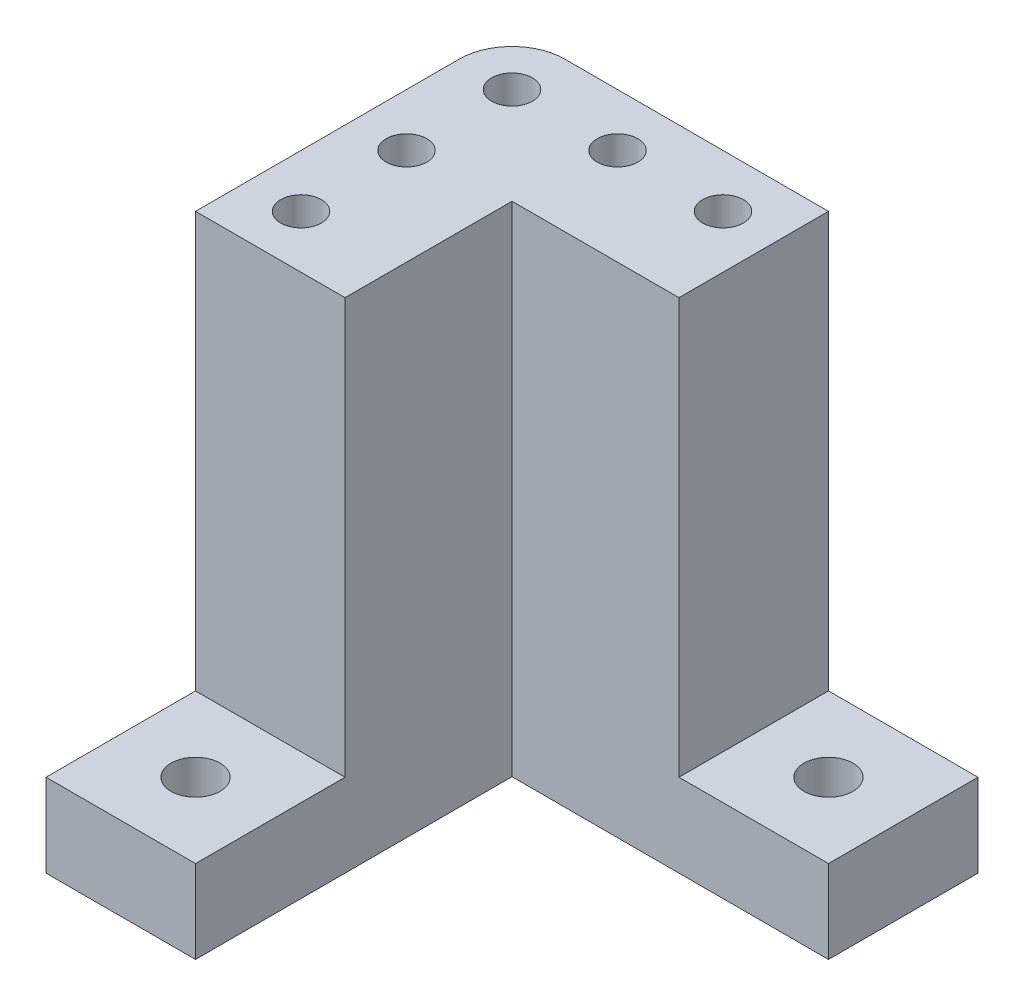
ISO-10303-21;
HEADER;
FILE_DESCRIPTION(('STEP AP214'),'2;1');
FILE_NAME('part.step','',(''),(''),'','','');
FILE_SCHEMA(('AUTOMOTIVE_DESIGN { 1 0 10303 214 1 1 1 1 }'));
ENDSEC;
DATA;
#1=APPLICATION_CONTEXT('core data for automotive mechanical design processes');
#2=APPLICATION_PROTOCOL_DEFINITION('international standard','automotive_design',2000,#1);
#3=PRODUCT_CONTEXT('',#1,'mechanical');
#4=PRODUCT('Part','Part','',(#3));
#5=PRODUCT_RELATED_PRODUCT_CATEGORY('part','',(#4));
#6=PRODUCT_DEFINITION_FORMATION('','',#4);
#7=PRODUCT_DEFINITION_CONTEXT('part definition',#1,'design');
#8=PRODUCT_DEFINITION('design','',#6,#7);
#9=PRODUCT_DEFINITION_SHAPE('','',#8);
#10=(LENGTH_UNIT() NAMED_UNIT(*) SI_UNIT(.MILLI.,.METRE.));
#11=(NAMED_UNIT(*) PLANE_ANGLE_UNIT() SI_UNIT($,.RADIAN.));
#12=(NAMED_UNIT(*) SI_UNIT($,.STERADIAN.) SOLID_ANGLE_UNIT());
#13=UNCERTAINTY_MEASURE_WITH_UNIT(LENGTH_MEASURE(1.E-05),#10,'distance_accuracy_value','');
#14=(GEOMETRIC_REPRESENTATION_CONTEXT(3) GLOBAL_UNCERTAINTY_ASSIGNED_CONTEXT((#13)) GLOBAL_UNIT_ASSIGNED_CONTEXT((#10,
#11,#12)) REPRESENTATION_CONTEXT('',''));
#15=CARTESIAN_POINT('',(0.,0.,0.));
#16=DIRECTION('',(0.,0.,1.));
#17=DIRECTION('',(1.,0.,0.));
#18=AXIS2_PLACEMENT_3D('',#15,#16,#17);
#19=CARTESIAN_POINT('',(0.,60.,0.));
#20=DIRECTION('',(0.,1.,0.));
#21=DIRECTION('',(0.,0.,1.));
#22=AXIS2_PLACEMENT_3D('',#19,#20,#21);
#23=PLANE('',#22);
#24=CARTESIAN_POINT('',(6.35000000000002,60.,6.35000000000001));
#25=DIRECTION('',(0.,1.,0.));
#26=DIRECTION('',(0.,0.,1.));
#27=AXIS2_PLACEMENT_3D('',#24,#25,#26);
#28=CIRCLE('',#27,2.45);
#29=CARTESIAN_POINT('',(6.35000000000002,60.,8.80000000000001));
#30=VERTEX_POINT('',#29);
#31=EDGE_CURVE('E191',#30,#30,#28,.T.);
#32=ORIENTED_EDGE('',*,*,#31,.F.);
#33=EDGE_LOOP('',(#32));
#34=FACE_BOUND('',#33,.T.);
#35=CARTESIAN_POINT('',(6.35000000000002,60.,19.05));
#36=DIRECTION('',(0.,1.,0.));
#37=DIRECTION('',(0.,0.,1.));
#38=AXIS2_PLACEMENT_3D('',#35,#36,#37);
#39=CIRCLE('',#38,2.45);
#40=CARTESIAN_POINT('',(6.35000000000002,60.,21.5));
#41=VERTEX_POINT('',#40);
#42=EDGE_CURVE('E188',#41,#41,#39,.T.);
#43=ORIENTED_EDGE('',*,*,#42,.F.);
#44=EDGE_LOOP('',(#43));
#45=FACE_BOUND('',#44,.T.);
#46=CARTESIAN_POINT('',(6.35000000000002,60.,31.75));
#47=DIRECTION('',(0.,1.,0.));
#48=DIRECTION('',(0.,0.,1.));
#49=AXIS2_PLACEMENT_3D('',#46,#47,#48);
#50=CIRCLE('',#49,2.45);
#51=CARTESIAN_POINT('',(6.35000000000002,60.,34.2));
#52=VERTEX_POINT('',#51);
#53=EDGE_CURVE('E195',#52,#52,#50,.T.);
#54=ORIENTED_EDGE('',*,*,#53,.F.);
#55=EDGE_LOOP('',(#54));
#56=FACE_BOUND('',#55,.T.);
#57=CARTESIAN_POINT('',(19.05,60.,6.35000000000001));
#58=DIRECTION('',(0.,1.,0.));
#59=DIRECTION('',(0.,0.,1.));
#60=AXIS2_PLACEMENT_3D('',#57,#58,#59);
#61=CIRCLE('',#60,2.45);
#62=CARTESIAN_POINT('',(19.05,60.,8.80000000000001));
#63=VERTEX_POINT('',#62);
#64=EDGE_CURVE('E201',#63,#63,#61,.T.);
#65=ORIENTED_EDGE('',*,*,#64,.F.);
#66=EDGE_LOOP('',(#65));
#67=FACE_BOUND('',#66,.T.);
#68=CARTESIAN_POINT('',(31.75,60.,6.35000000000001));
#69=DIRECTION('',(0.,1.,0.));
#70=DIRECTION('',(0.,0.,1.));
#71=AXIS2_PLACEMENT_3D('',#68,#69,#70);
#72=CIRCLE('',#71,2.45);
#73=CARTESIAN_POINT('',(31.75,60.,8.80000000000001));
#74=VERTEX_POINT('',#73);
#75=EDGE_CURVE('E207',#74,#74,#72,.T.);
#76=ORIENTED_EDGE('',*,*,#75,.F.);
#77=EDGE_LOOP('',(#76));
#78=FACE_BOUND('',#77,.T.);
#79=CARTESIAN_POINT('',(6.35000000000002,60.,6.35000000000002));
#80=DIRECTION('',(0.,-1.,0.));
#81=DIRECTION('',(0.,0.,1.));
#82=AXIS2_PLACEMENT_3D('',#79,#80,#81);
#83=CIRCLE('',#82,6.35000000000002);
#84=CARTESIAN_POINT('',(0.,60.,6.35000000000001));
#85=VERTEX_POINT('',#84);
#86=CARTESIAN_POINT('',(6.35000000000002,60.,0.));
#87=VERTEX_POINT('',#86);
#88=EDGE_CURVE('E151',#85,#87,#83,.T.);
#89=ORIENTED_EDGE('',*,*,#88,.F.);
#90=DIRECTION('',(0.,0.,1.));
#91=VECTOR('',#90,1.);
#92=CARTESIAN_POINT('',(0.,60.,0.));
#93=LINE('',#92,#91);
#94=CARTESIAN_POINT('',(0.,60.,38.1));
#95=VERTEX_POINT('',#94);
#96=EDGE_CURVE('E218',#85,#95,#93,.T.);
#97=ORIENTED_EDGE('',*,*,#96,.T.);
#98=DIRECTION('',(1.,0.,0.));
#99=VECTOR('',#98,1.);
#100=CARTESIAN_POINT('',(0.,60.,38.1));
#101=LINE('',#100,#99);
#102=CARTESIAN_POINT('',(18.,60.,38.1));
#103=VERTEX_POINT('',#102);
#104=EDGE_CURVE('E220',#95,#103,#101,.T.);
#105=ORIENTED_EDGE('',*,*,#104,.T.);
#106=DIRECTION('',(0.,0.,-1.));
#107=VECTOR('',#106,1.);
#108=CARTESIAN_POINT('',(18.,60.,38.1));
#109=LINE('',#108,#107);
#110=CARTESIAN_POINT('',(18.,60.,18.));
#111=VERTEX_POINT('',#110);
#112=EDGE_CURVE('E223',#103,#111,#109,.T.);
#113=ORIENTED_EDGE('',*,*,#112,.T.);
#114=DIRECTION('',(1.,0.,0.));
#115=VECTOR('',#114,1.);
#116=CARTESIAN_POINT('',(18.,60.,18.));
#117=LINE('',#116,#115);
#118=CARTESIAN_POINT('',(38.1,60.,18.));
#119=VERTEX_POINT('',#118);
#120=EDGE_CURVE('E225',#111,#119,#117,.T.);
#121=ORIENTED_EDGE('',*,*,#120,.T.);
#122=DIRECTION('',(0.,0.,-1.));
#123=VECTOR('',#122,1.);
#124=CARTESIAN_POINT('',(38.1,60.,18.));
#125=LINE('',#124,#123);
#126=CARTESIAN_POINT('',(38.1,60.,0.));
#127=VERTEX_POINT('',#126);
#128=EDGE_CURVE('E227',#119,#127,#125,.T.);
#129=ORIENTED_EDGE('',*,*,#128,.T.);
#130=DIRECTION('',(-1.,0.,0.));
#131=VECTOR('',#130,1.);
#132=CARTESIAN_POINT('',(0.,60.,0.));
#133=LINE('',#132,#131);
#134=EDGE_CURVE('E229',#127,#87,#133,.T.);
#135=ORIENTED_EDGE('',*,*,#134,.T.);
#136=EDGE_LOOP('',(#89,#97,#105,#113,#121,#129,#135));
#137=FACE_BOUND('',#136,.T.);
#138=ADVANCED_FACE('F39',(#34,#45,#56,#67,#78,#137),#23,.T.);
#139=CARTESIAN_POINT('',(0.,0.,0.));
#140=DIRECTION('',(0.,1.,0.));
#141=DIRECTION('',(0.,0.,1.));
#142=AXIS2_PLACEMENT_3D('',#139,#140,#141);
#143=PLANE('',#142);
#144=CARTESIAN_POINT('',(31.75,0.,6.35000000000001));
#145=DIRECTION('',(0.,1.,0.));
#146=DIRECTION('',(0.,0.,1.));
#147=AXIS2_PLACEMENT_3D('',#144,#145,#146);
#148=CIRCLE('',#147,2.45);
#149=CARTESIAN_POINT('',(31.75,0.,8.80000000000001));
#150=VERTEX_POINT('',#149);
#151=EDGE_CURVE('E185',#150,#150,#148,.T.);
#152=ORIENTED_EDGE('',*,*,#151,.T.);
#153=EDGE_LOOP('',(#152));
#154=FACE_BOUND('',#153,.T.);
#155=CARTESIAN_POINT('',(19.05,0.,6.35000000000001));
#156=DIRECTION('',(0.,1.,0.));
#157=DIRECTION('',(0.,0.,1.));
#158=AXIS2_PLACEMENT_3D('',#155,#156,#157);
#159=CIRCLE('',#158,2.45);
#160=CARTESIAN_POINT('',(19.05,0.,8.80000000000001));
#161=VERTEX_POINT('',#160);
#162=EDGE_CURVE('E204',#161,#161,#159,.T.);
#163=ORIENTED_EDGE('',*,*,#162,.T.);
#164=EDGE_LOOP('',(#163));
#165=FACE_BOUND('',#164,.T.);
#166=CARTESIAN_POINT('',(6.35000000000002,0.,31.75));
#167=DIRECTION('',(0.,1.,0.));
#168=DIRECTION('',(0.,0.,1.));
#169=AXIS2_PLACEMENT_3D('',#166,#167,#168);
#170=CIRCLE('',#169,2.45);
#171=CARTESIAN_POINT('',(6.35000000000002,0.,34.2));
#172=VERTEX_POINT('',#171);
#173=EDGE_CURVE('E198',#172,#172,#170,.T.);
#174=ORIENTED_EDGE('',*,*,#173,.T.);
#175=EDGE_LOOP('',(#174));
#176=FACE_BOUND('',#175,.T.);
#177=CARTESIAN_POINT('',(6.35000000000002,0.,19.05));
#178=DIRECTION('',(0.,1.,0.));
#179=DIRECTION('',(0.,0.,1.));
#180=AXIS2_PLACEMENT_3D('',#177,#178,#179);
#181=CIRCLE('',#180,2.45);
#182=CARTESIAN_POINT('',(6.35000000000002,0.,21.5));
#183=VERTEX_POINT('',#182);
#184=EDGE_CURVE('E192',#183,#183,#181,.T.);
#185=ORIENTED_EDGE('',*,*,#184,.T.);
#186=EDGE_LOOP('',(#185));
#187=FACE_BOUND('',#186,.T.);
#188=CARTESIAN_POINT('',(6.35000000000002,0.,6.35000000000001));
#189=DIRECTION('',(0.,1.,0.));
#190=DIRECTION('',(0.,0.,1.));
#191=AXIS2_PLACEMENT_3D('',#188,#189,#190);
#192=CIRCLE('',#191,2.45);
#193=CARTESIAN_POINT('',(6.35000000000002,0.,8.80000000000001));
#194=VERTEX_POINT('',#193);
#195=EDGE_CURVE('E212',#194,#194,#192,.T.);
#196=ORIENTED_EDGE('',*,*,#195,.T.);
#197=EDGE_LOOP('',(#196));
#198=FACE_BOUND('',#197,.T.);
#199=DIRECTION('',(0.,0.,1.));
#200=VECTOR('',#199,1.);
#201=CARTESIAN_POINT('',(0.,0.,0.));
#202=LINE('',#201,#200);
#203=CARTESIAN_POINT('',(0.,0.,6.35000000000001));
#204=VERTEX_POINT('',#203);
#205=CARTESIAN_POINT('',(0.,0.,56.1));
#206=VERTEX_POINT('',#205);
#207=EDGE_CURVE('E215',#204,#206,#202,.T.);
#208=ORIENTED_EDGE('',*,*,#207,.F.);
#209=CARTESIAN_POINT('',(6.35000000000002,0.,6.35000000000002));
#210=DIRECTION('',(0.,-1.,0.));
#211=DIRECTION('',(0.,0.,1.));
#212=AXIS2_PLACEMENT_3D('',#209,#210,#211);
#213=CIRCLE('',#212,6.35000000000002);
#214=CARTESIAN_POINT('',(6.35000000000002,0.,0.));
#215=VERTEX_POINT('',#214);
#216=EDGE_CURVE('E178',#204,#215,#213,.T.);
#217=ORIENTED_EDGE('',*,*,#216,.T.);
#218=DIRECTION('',(-1.,0.,0.));
#219=VECTOR('',#218,1.);
#220=CARTESIAN_POINT('',(0.,0.,0.));
#221=LINE('',#220,#219);
#222=CARTESIAN_POINT('',(56.1,0.,0.));
#223=VERTEX_POINT('',#222);
#224=EDGE_CURVE('E221',#223,#215,#221,.T.);
#225=ORIENTED_EDGE('',*,*,#224,.F.);
#226=DIRECTION('',(0.,0.,1.));
#227=VECTOR('',#226,1.);
#228=CARTESIAN_POINT('',(56.1,0.,0.));
#229=LINE('',#228,#227);
#230=CARTESIAN_POINT('',(56.1,0.,18.));
#231=VERTEX_POINT('',#230);
#232=EDGE_CURVE('E160',#223,#231,#229,.T.);
#233=ORIENTED_EDGE('',*,*,#232,.T.);
#234=DIRECTION('',(1.,0.,0.));
#235=VECTOR('',#234,1.);
#236=CARTESIAN_POINT('',(18.,0.,18.));
#237=LINE('',#236,#235);
#238=CARTESIAN_POINT('',(18.,0.,18.));
#239=VERTEX_POINT('',#238);
#240=EDGE_CURVE('E236',#239,#231,#237,.T.);
#241=ORIENTED_EDGE('',*,*,#240,.F.);
#242=DIRECTION('',(0.,0.,-1.));
#243=VECTOR('',#242,1.);
#244=CARTESIAN_POINT('',(18.,0.,38.1));
#245=LINE('',#244,#243);
#246=CARTESIAN_POINT('',(18.,0.,56.1));
#247=VERTEX_POINT('',#246);
#248=EDGE_CURVE('E234',#247,#239,#245,.T.);
#249=ORIENTED_EDGE('',*,*,#248,.F.);
#250=DIRECTION('',(-1.,0.,0.));
#251=VECTOR('',#250,1.);
#252=CARTESIAN_POINT('',(18.,0.,56.1));
#253=LINE('',#252,#251);
#254=EDGE_CURVE('E131',#247,#206,#253,.T.);
#255=ORIENTED_EDGE('',*,*,#254,.T.);
#256=EDGE_LOOP('',(#208,#217,#225,#233,#241,#249,#255));
#257=FACE_BOUND('',#256,.T.);
#258=CARTESIAN_POINT('',(47.1,0.,9.));
#259=DIRECTION('',(0.,-1.,0.));
#260=DIRECTION('',(0.,0.,-1.));
#261=AXIS2_PLACEMENT_3D('',#258,#259,#260);
#262=CIRCLE('',#261,2.95);
#263=CARTESIAN_POINT('',(47.1,0.,6.04999999999999));
#264=VERTEX_POINT('',#263);
#265=EDGE_CURVE('E172',#264,#264,#262,.T.);
#266=ORIENTED_EDGE('',*,*,#265,.F.);
#267=EDGE_LOOP('',(#266));
#268=FACE_BOUND('',#267,.T.);
#269=CARTESIAN_POINT('',(9.,0.,47.1));
#270=DIRECTION('',(0.,-1.,0.));
#271=DIRECTION('',(0.,0.,-1.));
#272=AXIS2_PLACEMENT_3D('',#269,#270,#271);
#273=CIRCLE('',#272,2.95);
#274=CARTESIAN_POINT('',(9.,0.,44.15));
#275=VERTEX_POINT('',#274);
#276=EDGE_CURVE('E175',#275,#275,#273,.T.);
#277=ORIENTED_EDGE('',*,*,#276,.F.);
#278=EDGE_LOOP('',(#277));
#279=FACE_BOUND('',#278,.T.);
#280=ADVANCED_FACE('F255',(#154,#165,#176,#187,#198,#257,#268,#279),#143,.F.);
#281=CARTESIAN_POINT('',(0.,60.,0.));
#282=DIRECTION('',(1.,0.,0.));
#283=DIRECTION('',(0.,0.,-1.));
#284=AXIS2_PLACEMENT_3D('',#281,#282,#283);
#285=PLANE('',#284);
#286=ORIENTED_EDGE('',*,*,#96,.F.);
#287=DIRECTION('',(0.,1.,0.));
#288=VECTOR('',#287,1.);
#289=CARTESIAN_POINT('',(0.,0.,6.35000000000001));
#290=LINE('',#289,#288);
#291=EDGE_CURVE('E183',#204,#85,#290,.T.);
#292=ORIENTED_EDGE('',*,*,#291,.F.);
#293=ORIENTED_EDGE('',*,*,#207,.T.);
#294=DIRECTION('',(0.,-1.,0.));
#295=VECTOR('',#294,1.);
#296=CARTESIAN_POINT('',(0.,10.,56.1));
#297=LINE('',#296,#295);
#298=CARTESIAN_POINT('',(0.,10.,56.1));
#299=VERTEX_POINT('',#298);
#300=EDGE_CURVE('E133',#299,#206,#297,.T.);
#301=ORIENTED_EDGE('',*,*,#300,.F.);
#302=DIRECTION('',(0.,0.,-1.));
#303=VECTOR('',#302,1.);
#304=CARTESIAN_POINT('',(0.,10.,38.1));
#305=LINE('',#304,#303);
#306=CARTESIAN_POINT('',(0.,10.,38.1));
#307=VERTEX_POINT('',#306);
#308=EDGE_CURVE('E134',#299,#307,#305,.T.);
#309=ORIENTED_EDGE('',*,*,#308,.T.);
#310=DIRECTION('',(0.,-1.,0.));
#311=VECTOR('',#310,1.);
#312=CARTESIAN_POINT('',(0.,60.,38.1));
#313=LINE('',#312,#311);
#314=EDGE_CURVE('E11',#95,#307,#313,.T.);
#315=ORIENTED_EDGE('',*,*,#314,.F.);
#316=EDGE_LOOP('',(#286,#292,#293,#301,#309,#315));
#317=FACE_BOUND('',#316,.T.);
#318=ADVANCED_FACE('F41',(#317),#285,.F.);
#319=CARTESIAN_POINT('',(0.,60.,38.1));
#320=DIRECTION('',(0.,0.,-1.));
#321=DIRECTION('',(-1.,0.,0.));
#322=AXIS2_PLACEMENT_3D('',#319,#320,#321);
#323=PLANE('',#322);
#324=ORIENTED_EDGE('',*,*,#314,.T.);
#325=DIRECTION('',(1.,0.,0.));
#326=VECTOR('',#325,1.);
#327=CARTESIAN_POINT('',(0.,10.,38.1));
#328=LINE('',#327,#326);
#329=CARTESIAN_POINT('',(18.,10.,38.1));
#330=VERTEX_POINT('',#329);
#331=EDGE_CURVE('E143',#307,#330,#328,.T.);
#332=ORIENTED_EDGE('',*,*,#331,.T.);
#333=DIRECTION('',(0.,-1.,0.));
#334=VECTOR('',#333,1.);
#335=CARTESIAN_POINT('',(18.,60.,38.1));
#336=LINE('',#335,#334);
#337=EDGE_CURVE('E47',#103,#330,#336,.T.);
#338=ORIENTED_EDGE('',*,*,#337,.F.);
#339=ORIENTED_EDGE('',*,*,#104,.F.);
#340=EDGE_LOOP('',(#324,#332,#338,#339));
#341=FACE_BOUND('',#340,.T.);
#342=ADVANCED_FACE('F275',(#341),#323,.F.);
#343=CARTESIAN_POINT('',(18.,60.,38.1));
#344=DIRECTION('',(-1.,0.,0.));
#345=DIRECTION('',(0.,0.,1.));
#346=AXIS2_PLACEMENT_3D('',#343,#344,#345);
#347=PLANE('',#346);
#348=ORIENTED_EDGE('',*,*,#248,.T.);
#349=DIRECTION('',(0.,-1.,0.));
#350=VECTOR('',#349,1.);
#351=CARTESIAN_POINT('',(18.,60.,18.));
#352=LINE('',#351,#350);
#353=EDGE_CURVE('E245',#111,#239,#352,.T.);
#354=ORIENTED_EDGE('',*,*,#353,.F.);
#355=ORIENTED_EDGE('',*,*,#112,.F.);
#356=ORIENTED_EDGE('',*,*,#337,.T.);
#357=DIRECTION('',(0.,0.,1.));
#358=VECTOR('',#357,1.);
#359=CARTESIAN_POINT('',(18.,10.,38.1));
#360=LINE('',#359,#358);
#361=CARTESIAN_POINT('',(18.,10.,56.1));
#362=VERTEX_POINT('',#361);
#363=EDGE_CURVE('E54',#330,#362,#360,.T.);
#364=ORIENTED_EDGE('',*,*,#363,.T.);
#365=DIRECTION('',(0.,-1.,0.));
#366=VECTOR('',#365,1.);
#367=CARTESIAN_POINT('',(18.,10.,56.1));
#368=LINE('',#367,#366);
#369=EDGE_CURVE('E125',#362,#247,#368,.T.);
#370=ORIENTED_EDGE('',*,*,#369,.T.);
#371=EDGE_LOOP('',(#348,#354,#355,#356,#364,#370));
#372=FACE_BOUND('',#371,.T.);
#373=ADVANCED_FACE('F140',(#372),#347,.F.);
#374=CARTESIAN_POINT('',(18.,60.,18.));
#375=DIRECTION('',(0.,0.,-1.));
#376=DIRECTION('',(-1.,0.,0.));
#377=AXIS2_PLACEMENT_3D('',#374,#375,#376);
#378=PLANE('',#377);
#379=ORIENTED_EDGE('',*,*,#240,.T.);
#380=DIRECTION('',(0.,-1.,0.));
#381=VECTOR('',#380,1.);
#382=CARTESIAN_POINT('',(56.1,10.,18.));
#383=LINE('',#382,#381);
#384=CARTESIAN_POINT('',(56.1,10.,18.));
#385=VERTEX_POINT('',#384);
#386=EDGE_CURVE('E157',#385,#231,#383,.T.);
#387=ORIENTED_EDGE('',*,*,#386,.F.);
#388=DIRECTION('',(-1.,0.,0.));
#389=VECTOR('',#388,1.);
#390=CARTESIAN_POINT('',(56.1,10.,18.));
#391=LINE('',#390,#389);
#392=CARTESIAN_POINT('',(38.1,10.,18.));
#393=VERTEX_POINT('',#392);
#394=EDGE_CURVE('E164',#385,#393,#391,.T.);
#395=ORIENTED_EDGE('',*,*,#394,.T.);
#396=DIRECTION('',(0.,-1.,0.));
#397=VECTOR('',#396,1.);
#398=CARTESIAN_POINT('',(38.1,60.,18.));
#399=LINE('',#398,#397);
#400=EDGE_CURVE('E242',#119,#393,#399,.T.);
#401=ORIENTED_EDGE('',*,*,#400,.F.);
#402=ORIENTED_EDGE('',*,*,#120,.F.);
#403=ORIENTED_EDGE('',*,*,#353,.T.);
#404=EDGE_LOOP('',(#379,#387,#395,#401,#402,#403));
#405=FACE_BOUND('',#404,.T.);
#406=ADVANCED_FACE('F251',(#405),#378,.F.);
#407=CARTESIAN_POINT('',(38.1,60.,18.));
#408=DIRECTION('',(-1.,0.,0.));
#409=DIRECTION('',(0.,0.,1.));
#410=AXIS2_PLACEMENT_3D('',#407,#408,#409);
#411=PLANE('',#410);
#412=ORIENTED_EDGE('',*,*,#400,.T.);
#413=DIRECTION('',(0.,0.,-1.));
#414=VECTOR('',#413,1.);
#415=CARTESIAN_POINT('',(38.1,10.,18.));
#416=LINE('',#415,#414);
#417=CARTESIAN_POINT('',(38.1,10.,0.));
#418=VERTEX_POINT('',#417);
#419=EDGE_CURVE('E168',#393,#418,#416,.T.);
#420=ORIENTED_EDGE('',*,*,#419,.T.);
#421=DIRECTION('',(0.,-1.,0.));
#422=VECTOR('',#421,1.);
#423=CARTESIAN_POINT('',(38.1,60.,0.));
#424=LINE('',#423,#422);
#425=EDGE_CURVE('E232',#127,#418,#424,.T.);
#426=ORIENTED_EDGE('',*,*,#425,.F.);
#427=ORIENTED_EDGE('',*,*,#128,.F.);
#428=EDGE_LOOP('',(#412,#420,#426,#427));
#429=FACE_BOUND('',#428,.T.);
#430=ADVANCED_FACE('F264',(#429),#411,.F.);
#431=CARTESIAN_POINT('',(0.,60.,0.));
#432=DIRECTION('',(0.,0.,1.));
#433=DIRECTION('',(1.,0.,0.));
#434=AXIS2_PLACEMENT_3D('',#431,#432,#433);
#435=PLANE('',#434);
#436=ORIENTED_EDGE('',*,*,#224,.T.);
#437=DIRECTION('',(0.,1.,0.));
#438=VECTOR('',#437,1.);
#439=CARTESIAN_POINT('',(6.35000000000002,0.,0.));
#440=LINE('',#439,#438);
#441=EDGE_CURVE('E181',#215,#87,#440,.T.);
#442=ORIENTED_EDGE('',*,*,#441,.T.);
#443=ORIENTED_EDGE('',*,*,#134,.F.);
#444=ORIENTED_EDGE('',*,*,#425,.T.);
#445=DIRECTION('',(1.,0.,0.));
#446=VECTOR('',#445,1.);
#447=CARTESIAN_POINT('',(38.1,10.,0.));
#448=LINE('',#447,#446);
#449=CARTESIAN_POINT('',(56.1,10.,0.));
#450=VERTEX_POINT('',#449);
#451=EDGE_CURVE('E62',#418,#450,#448,.T.);
#452=ORIENTED_EDGE('',*,*,#451,.T.);
#453=DIRECTION('',(0.,-1.,0.));
#454=VECTOR('',#453,1.);
#455=CARTESIAN_POINT('',(56.1,10.,0.));
#456=LINE('',#455,#454);
#457=EDGE_CURVE('E153',#450,#223,#456,.T.);
#458=ORIENTED_EDGE('',*,*,#457,.T.);
#459=EDGE_LOOP('',(#436,#442,#443,#444,#452,#458));
#460=FACE_BOUND('',#459,.T.);
#461=ADVANCED_FACE('F268',(#460),#435,.F.);
#462=CARTESIAN_POINT('',(6.35000000000002,0.,6.35000000000001));
#463=DIRECTION('',(0.,1.,0.));
#464=DIRECTION('',(0.,0.,1.));
#465=AXIS2_PLACEMENT_3D('',#462,#463,#464);
#466=CYLINDRICAL_SURFACE('',#465,2.45);
#467=ORIENTED_EDGE('',*,*,#195,.F.);
#468=EDGE_LOOP('',(#467));
#469=FACE_BOUND('',#468,.T.);
#470=ORIENTED_EDGE('',*,*,#31,.T.);
#471=EDGE_LOOP('',(#470));
#472=FACE_BOUND('',#471,.T.);
#473=ADVANCED_FACE('F304',(#469,#472),#466,.F.);
#474=CARTESIAN_POINT('',(6.35000000000002,0.,19.05));
#475=DIRECTION('',(0.,1.,0.));
#476=DIRECTION('',(0.,0.,1.));
#477=AXIS2_PLACEMENT_3D('',#474,#475,#476);
#478=CYLINDRICAL_SURFACE('',#477,2.45);
#479=ORIENTED_EDGE('',*,*,#184,.F.);
#480=EDGE_LOOP('',(#479));
#481=FACE_BOUND('',#480,.T.);
#482=ORIENTED_EDGE('',*,*,#42,.T.);
#483=EDGE_LOOP('',(#482));
#484=FACE_BOUND('',#483,.T.);
#485=ADVANCED_FACE('F366',(#481,#484),#478,.F.);
#486=CARTESIAN_POINT('',(6.35000000000002,0.,31.75));
#487=DIRECTION('',(0.,1.,0.));
#488=DIRECTION('',(0.,0.,1.));
#489=AXIS2_PLACEMENT_3D('',#486,#487,#488);
#490=CYLINDRICAL_SURFACE('',#489,2.45);
#491=ORIENTED_EDGE('',*,*,#173,.F.);
#492=EDGE_LOOP('',(#491));
#493=FACE_BOUND('',#492,.T.);
#494=ORIENTED_EDGE('',*,*,#53,.T.);
#495=EDGE_LOOP('',(#494));
#496=FACE_BOUND('',#495,.T.);
#497=ADVANCED_FACE('F356',(#493,#496),#490,.F.);
#498=CARTESIAN_POINT('',(19.05,0.,6.35000000000001));
#499=DIRECTION('',(0.,1.,0.));
#500=DIRECTION('',(0.,0.,1.));
#501=AXIS2_PLACEMENT_3D('',#498,#499,#500);
#502=CYLINDRICAL_SURFACE('',#501,2.45);
#503=ORIENTED_EDGE('',*,*,#162,.F.);
#504=EDGE_LOOP('',(#503));
#505=FACE_BOUND('',#504,.T.);
#506=ORIENTED_EDGE('',*,*,#64,.T.);
#507=EDGE_LOOP('',(#506));
#508=FACE_BOUND('',#507,.T.);
#509=ADVANCED_FACE('F290',(#505,#508),#502,.F.);
#510=CARTESIAN_POINT('',(31.75,0.,6.35000000000001));
#511=DIRECTION('',(0.,1.,0.));
#512=DIRECTION('',(0.,0.,1.));
#513=AXIS2_PLACEMENT_3D('',#510,#511,#512);
#514=CYLINDRICAL_SURFACE('',#513,2.45);
#515=ORIENTED_EDGE('',*,*,#151,.F.);
#516=EDGE_LOOP('',(#515));
#517=FACE_BOUND('',#516,.T.);
#518=ORIENTED_EDGE('',*,*,#75,.T.);
#519=EDGE_LOOP('',(#518));
#520=FACE_BOUND('',#519,.T.);
#521=ADVANCED_FACE('F281',(#517,#520),#514,.F.);
#522=CARTESIAN_POINT('',(6.35000000000002,0.,6.35000000000002));
#523=DIRECTION('',(0.,1.,0.));
#524=DIRECTION('',(0.,0.,1.));
#525=AXIS2_PLACEMENT_3D('',#522,#523,#524);
#526=CYLINDRICAL_SURFACE('',#525,6.35000000000002);
#527=ORIENTED_EDGE('',*,*,#88,.T.);
#528=ORIENTED_EDGE('',*,*,#441,.F.);
#529=ORIENTED_EDGE('',*,*,#216,.F.);
#530=ORIENTED_EDGE('',*,*,#291,.T.);
#531=EDGE_LOOP('',(#527,#528,#529,#530));
#532=FACE_BOUND('',#531,.T.);
#533=ADVANCED_FACE('F279',(#532),#526,.T.);
#534=CARTESIAN_POINT('',(56.1,10.,0.));
#535=DIRECTION('',(1.,0.,0.));
#536=DIRECTION('',(0.,0.,-1.));
#537=AXIS2_PLACEMENT_3D('',#534,#535,#536);
#538=PLANE('',#537);
#539=ORIENTED_EDGE('',*,*,#232,.F.);
#540=ORIENTED_EDGE('',*,*,#457,.F.);
#541=DIRECTION('',(0.,0.,1.));
#542=VECTOR('',#541,1.);
#543=CARTESIAN_POINT('',(56.1,10.,0.));
#544=LINE('',#543,#542);
#545=EDGE_CURVE('E156',#450,#385,#544,.T.);
#546=ORIENTED_EDGE('',*,*,#545,.T.);
#547=ORIENTED_EDGE('',*,*,#386,.T.);
#548=EDGE_LOOP('',(#539,#540,#546,#547));
#549=FACE_BOUND('',#548,.T.);
#550=ADVANCED_FACE('F259',(#549),#538,.T.);
#551=CARTESIAN_POINT('',(0.,10.,0.));
#552=DIRECTION('',(0.,-1.,0.));
#553=DIRECTION('',(0.,0.,-1.));
#554=AXIS2_PLACEMENT_3D('',#551,#552,#553);
#555=PLANE('',#554);
#556=CARTESIAN_POINT('',(47.1,10.,9.));
#557=DIRECTION('',(0.,-1.,0.));
#558=DIRECTION('',(0.,0.,-1.));
#559=AXIS2_PLACEMENT_3D('',#556,#557,#558);
#560=CIRCLE('',#559,2.95);
#561=CARTESIAN_POINT('',(47.1,10.,6.04999999999999));
#562=VERTEX_POINT('',#561);
#563=EDGE_CURVE('E163',#562,#562,#560,.T.);
#564=ORIENTED_EDGE('',*,*,#563,.T.);
#565=EDGE_LOOP('',(#564));
#566=FACE_BOUND('',#565,.T.);
#567=ORIENTED_EDGE('',*,*,#394,.F.);
#568=ORIENTED_EDGE('',*,*,#545,.F.);
#569=ORIENTED_EDGE('',*,*,#451,.F.);
#570=ORIENTED_EDGE('',*,*,#419,.F.);
#571=EDGE_LOOP('',(#567,#568,#569,#570));
#572=FACE_BOUND('',#571,.T.);
#573=ADVANCED_FACE('F261',(#566,#572),#555,.F.);
#574=CARTESIAN_POINT('',(47.1,10.,9.));
#575=DIRECTION('',(0.,-1.,0.));
#576=DIRECTION('',(0.,0.,-1.));
#577=AXIS2_PLACEMENT_3D('',#574,#575,#576);
#578=CYLINDRICAL_SURFACE('',#577,2.95);
#579=ORIENTED_EDGE('',*,*,#563,.F.);
#580=EDGE_LOOP('',(#579));
#581=FACE_BOUND('',#580,.T.);
#582=ORIENTED_EDGE('',*,*,#265,.T.);
#583=EDGE_LOOP('',(#582));
#584=FACE_BOUND('',#583,.T.);
#585=ADVANCED_FACE('F434',(#581,#584),#578,.F.);
#586=CARTESIAN_POINT('',(18.,10.,56.1));
#587=DIRECTION('',(0.,0.,1.));
#588=DIRECTION('',(1.,0.,0.));
#589=AXIS2_PLACEMENT_3D('',#586,#587,#588);
#590=PLANE('',#589);
#591=ORIENTED_EDGE('',*,*,#254,.F.);
#592=ORIENTED_EDGE('',*,*,#369,.F.);
#593=DIRECTION('',(-1.,0.,0.));
#594=VECTOR('',#593,1.);
#595=CARTESIAN_POINT('',(18.,10.,56.1));
#596=LINE('',#595,#594);
#597=EDGE_CURVE('E128',#362,#299,#596,.T.);
#598=ORIENTED_EDGE('',*,*,#597,.T.);
#599=ORIENTED_EDGE('',*,*,#300,.T.);
#600=EDGE_LOOP('',(#591,#592,#598,#599));
#601=FACE_BOUND('',#600,.T.);
#602=ADVANCED_FACE('F126',(#601),#590,.T.);
#603=CARTESIAN_POINT('',(0.,10.,0.));
#604=DIRECTION('',(0.,-1.,0.));
#605=DIRECTION('',(0.,0.,-1.));
#606=AXIS2_PLACEMENT_3D('',#603,#604,#605);
#607=PLANE('',#606);
#608=CARTESIAN_POINT('',(9.,10.,47.1));
#609=DIRECTION('',(0.,-1.,0.));
#610=DIRECTION('',(0.,0.,-1.));
#611=AXIS2_PLACEMENT_3D('',#608,#609,#610);
#612=CIRCLE('',#611,2.95);
#613=CARTESIAN_POINT('',(9.,10.,44.15));
#614=VERTEX_POINT('',#613);
#615=EDGE_CURVE('E150',#614,#614,#612,.T.);
#616=ORIENTED_EDGE('',*,*,#615,.T.);
#617=EDGE_LOOP('',(#616));
#618=FACE_BOUND('',#617,.T.);
#619=ORIENTED_EDGE('',*,*,#331,.F.);
#620=ORIENTED_EDGE('',*,*,#308,.F.);
#621=ORIENTED_EDGE('',*,*,#597,.F.);
#622=ORIENTED_EDGE('',*,*,#363,.F.);
#623=EDGE_LOOP('',(#619,#620,#621,#622));
#624=FACE_BOUND('',#623,.T.);
#625=ADVANCED_FACE('F136',(#618,#624),#607,.F.);
#626=CARTESIAN_POINT('',(9.,10.,47.1));
#627=DIRECTION('',(0.,-1.,0.));
#628=DIRECTION('',(0.,0.,-1.));
#629=AXIS2_PLACEMENT_3D('',#626,#627,#628);
#630=CYLINDRICAL_SURFACE('',#629,2.95);
#631=ORIENTED_EDGE('',*,*,#615,.F.);
#632=EDGE_LOOP('',(#631));
#633=FACE_BOUND('',#632,.T.);
#634=ORIENTED_EDGE('',*,*,#276,.T.);
#635=EDGE_LOOP('',(#634));
#636=FACE_BOUND('',#635,.T.);
#637=ADVANCED_FACE('F457',(#633,#636),#630,.F.);
#638=CLOSED_SHELL('',(#138,#280,#318,#342,#373,#406,#430,#461,#473,#485,#497,#509,#521,#533,
#550,#573,#585,#602,#625,#637));
#639=MANIFOLD_SOLID_BREP('B2',#638);
#640=ADVANCED_BREP_SHAPE_REPRESENTATION('',(#18,#639),#14);
#641=SHAPE_DEFINITION_REPRESENTATION(#9,#640);
ENDSEC;
END-ISO-10303-21;
